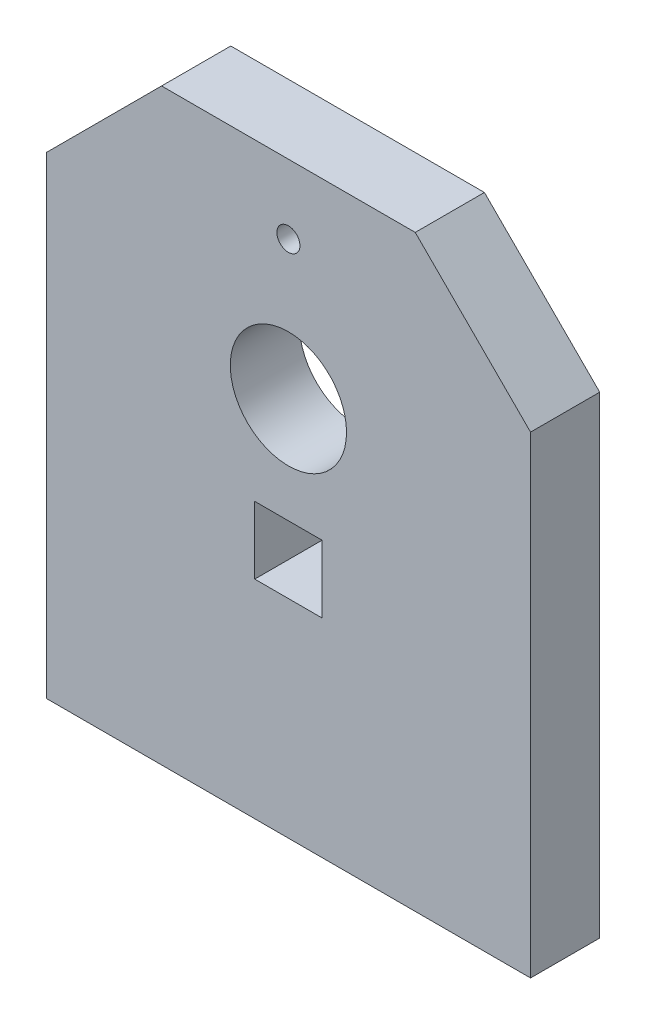
ISO-10303-21;
HEADER;
FILE_DESCRIPTION(('STEP AP214'),'2;1');
FILE_NAME('part.step','',(''),(''),'','','');
FILE_SCHEMA(('AUTOMOTIVE_DESIGN { 1 0 10303 214 1 1 1 1 }'));
ENDSEC;
DATA;
#1=APPLICATION_CONTEXT('core data for automotive mechanical design processes');
#2=APPLICATION_PROTOCOL_DEFINITION('international standard','automotive_design',2000,#1);
#3=PRODUCT_CONTEXT('',#1,'mechanical');
#4=PRODUCT('Part','Part','',(#3));
#5=PRODUCT_RELATED_PRODUCT_CATEGORY('part','',(#4));
#6=PRODUCT_DEFINITION_FORMATION('','',#4);
#7=PRODUCT_DEFINITION_CONTEXT('part definition',#1,'design');
#8=PRODUCT_DEFINITION('design','',#6,#7);
#9=PRODUCT_DEFINITION_SHAPE('','',#8);
#10=(LENGTH_UNIT() NAMED_UNIT(*) SI_UNIT(.MILLI.,.METRE.));
#11=(NAMED_UNIT(*) PLANE_ANGLE_UNIT() SI_UNIT($,.RADIAN.));
#12=(NAMED_UNIT(*) SI_UNIT($,.STERADIAN.) SOLID_ANGLE_UNIT());
#13=UNCERTAINTY_MEASURE_WITH_UNIT(LENGTH_MEASURE(1.E-05),#10,'distance_accuracy_value','');
#14=(GEOMETRIC_REPRESENTATION_CONTEXT(3) GLOBAL_UNCERTAINTY_ASSIGNED_CONTEXT((#13)) GLOBAL_UNIT_ASSIGNED_CONTEXT((#10,
#11,#12)) REPRESENTATION_CONTEXT('',''));
#15=CARTESIAN_POINT('',(0.,0.,0.));
#16=DIRECTION('',(0.,0.,1.));
#17=DIRECTION('',(1.,0.,0.));
#18=AXIS2_PLACEMENT_3D('',#15,#16,#17);
#19=CARTESIAN_POINT('',(0.,-1.87026845637584,3.));
#20=DIRECTION('',(0.,1.,0.));
#21=DIRECTION('',(-1.,0.,0.));
#22=AXIS2_PLACEMENT_3D('',#19,#20,#21);
#23=PLANE('',#22);
#24=DIRECTION('',(1.,0.,0.));
#25=VECTOR('',#24,1.);
#26=CARTESIAN_POINT('',(0.,-1.87026845637584,0.));
#27=LINE('',#26,#25);
#28=CARTESIAN_POINT('',(1.58825589961746,-1.87026845637584,0.));
#29=VERTEX_POINT('',#28);
#30=CARTESIAN_POINT('',(4.50825589961746,-1.87026845637584,0.));
#31=VERTEX_POINT('',#30);
#32=EDGE_CURVE('E167',#29,#31,#27,.T.);
#33=ORIENTED_EDGE('',*,*,#32,.T.);
#34=DIRECTION('',(0.,0.,-1.));
#35=VECTOR('',#34,1.);
#36=CARTESIAN_POINT('',(4.50825589961746,-1.87026845637584,3.));
#37=LINE('',#36,#35);
#38=CARTESIAN_POINT('',(4.50825589961746,-1.87026845637584,3.));
#39=VERTEX_POINT('',#38);
#40=EDGE_CURVE('E11',#39,#31,#37,.T.);
#41=ORIENTED_EDGE('',*,*,#40,.F.);
#42=DIRECTION('',(1.,0.,0.));
#43=VECTOR('',#42,1.);
#44=CARTESIAN_POINT('',(0.,-1.87026845637584,3.));
#45=LINE('',#44,#43);
#46=CARTESIAN_POINT('',(1.58825589961746,-1.87026845637584,3.));
#47=VERTEX_POINT('',#46);
#48=EDGE_CURVE('E126',#47,#39,#45,.T.);
#49=ORIENTED_EDGE('',*,*,#48,.F.);
#50=DIRECTION('',(0.,0.,-1.));
#51=VECTOR('',#50,1.);
#52=CARTESIAN_POINT('',(1.58825589961746,-1.87026845637584,3.));
#53=LINE('',#52,#51);
#54=EDGE_CURVE('E54',#47,#29,#53,.T.);
#55=ORIENTED_EDGE('',*,*,#54,.T.);
#56=EDGE_LOOP('',(#33,#41,#49,#55));
#57=FACE_BOUND('',#56,.T.);
#58=ADVANCED_FACE('F35',(#57),#23,.F.);
#59=CARTESIAN_POINT('',(4.50825589961746,0.,3.));
#60=DIRECTION('',(1.,0.,0.));
#61=DIRECTION('',(0.,0.,-1.));
#62=AXIS2_PLACEMENT_3D('',#59,#60,#61);
#63=PLANE('',#62);
#64=DIRECTION('',(0.,-1.,0.));
#65=VECTOR('',#64,1.);
#66=CARTESIAN_POINT('',(4.50825589961746,0.,0.));
#67=LINE('',#66,#65);
#68=CARTESIAN_POINT('',(4.50825589961746,-4.79026845637584,0.));
#69=VERTEX_POINT('',#68);
#70=EDGE_CURVE('E132',#31,#69,#67,.T.);
#71=ORIENTED_EDGE('',*,*,#70,.T.);
#72=DIRECTION('',(0.,0.,-1.));
#73=VECTOR('',#72,1.);
#74=CARTESIAN_POINT('',(4.50825589961746,-4.79026845637584,3.));
#75=LINE('',#74,#73);
#76=CARTESIAN_POINT('',(4.50825589961746,-4.79026845637584,3.));
#77=VERTEX_POINT('',#76);
#78=EDGE_CURVE('E45',#77,#69,#75,.T.);
#79=ORIENTED_EDGE('',*,*,#78,.F.);
#80=DIRECTION('',(0.,-1.,0.));
#81=VECTOR('',#80,1.);
#82=CARTESIAN_POINT('',(4.50825589961746,0.,3.));
#83=LINE('',#82,#81);
#84=EDGE_CURVE('E120',#39,#77,#83,.T.);
#85=ORIENTED_EDGE('',*,*,#84,.F.);
#86=ORIENTED_EDGE('',*,*,#40,.T.);
#87=EDGE_LOOP('',(#71,#79,#85,#86));
#88=FACE_BOUND('',#87,.T.);
#89=ADVANCED_FACE('F131',(#88),#63,.F.);
#90=CARTESIAN_POINT('',(0.,-4.79026845637584,3.));
#91=DIRECTION('',(0.,1.,0.));
#92=DIRECTION('',(-1.,0.,0.));
#93=AXIS2_PLACEMENT_3D('',#90,#91,#92);
#94=PLANE('',#93);
#95=DIRECTION('',(1.,0.,0.));
#96=VECTOR('',#95,1.);
#97=CARTESIAN_POINT('',(0.,-4.79026845637584,0.));
#98=LINE('',#97,#96);
#99=CARTESIAN_POINT('',(1.58825589961746,-4.79026845637584,0.));
#100=VERTEX_POINT('',#99);
#101=EDGE_CURVE('E170',#100,#69,#98,.T.);
#102=ORIENTED_EDGE('',*,*,#101,.F.);
#103=DIRECTION('',(0.,0.,-1.));
#104=VECTOR('',#103,1.);
#105=CARTESIAN_POINT('',(1.58825589961746,-4.79026845637584,3.));
#106=LINE('',#105,#104);
#107=CARTESIAN_POINT('',(1.58825589961746,-4.79026845637584,3.));
#108=VERTEX_POINT('',#107);
#109=EDGE_CURVE('E86',#108,#100,#106,.T.);
#110=ORIENTED_EDGE('',*,*,#109,.F.);
#111=DIRECTION('',(1.,0.,0.));
#112=VECTOR('',#111,1.);
#113=CARTESIAN_POINT('',(0.,-4.79026845637584,3.));
#114=LINE('',#113,#112);
#115=EDGE_CURVE('E125',#108,#77,#114,.T.);
#116=ORIENTED_EDGE('',*,*,#115,.T.);
#117=ORIENTED_EDGE('',*,*,#78,.T.);
#118=EDGE_LOOP('',(#102,#110,#116,#117));
#119=FACE_BOUND('',#118,.T.);
#120=ADVANCED_FACE('F136',(#119),#94,.T.);
#121=CARTESIAN_POINT('',(0.,11.7097315436242,3.));
#122=DIRECTION('',(0.,1.,0.));
#123=DIRECTION('',(-1.,0.,0.));
#124=AXIS2_PLACEMENT_3D('',#121,#122,#123);
#125=PLANE('',#124);
#126=DIRECTION('',(1.,0.,0.));
#127=VECTOR('',#126,1.);
#128=CARTESIAN_POINT('',(0.,11.7097315436242,0.));
#129=LINE('',#128,#127);
#130=CARTESIAN_POINT('',(-2.45174410038254,11.7097315436242,0.));
#131=VERTEX_POINT('',#130);
#132=CARTESIAN_POINT('',(8.54825589961746,11.7097315436242,0.));
#133=VERTEX_POINT('',#132);
#134=EDGE_CURVE('E149',#131,#133,#129,.T.);
#135=ORIENTED_EDGE('',*,*,#134,.F.);
#136=DIRECTION('',(0.,0.,-1.));
#137=VECTOR('',#136,1.);
#138=CARTESIAN_POINT('',(-2.45174410038254,11.7097315436242,3.));
#139=LINE('',#138,#137);
#140=CARTESIAN_POINT('',(-2.45174410038254,11.7097315436242,3.));
#141=VERTEX_POINT('',#140);
#142=EDGE_CURVE('E39',#141,#131,#139,.T.);
#143=ORIENTED_EDGE('',*,*,#142,.F.);
#144=DIRECTION('',(1.,0.,0.));
#145=VECTOR('',#144,1.);
#146=CARTESIAN_POINT('',(0.,11.7097315436242,3.));
#147=LINE('',#146,#145);
#148=CARTESIAN_POINT('',(8.54825589961746,11.7097315436242,3.));
#149=VERTEX_POINT('',#148);
#150=EDGE_CURVE('E200',#141,#149,#147,.T.);
#151=ORIENTED_EDGE('',*,*,#150,.T.);
#152=DIRECTION('',(0.,0.,-1.));
#153=VECTOR('',#152,1.);
#154=CARTESIAN_POINT('',(8.54825589961746,11.7097315436242,3.));
#155=LINE('',#154,#153);
#156=EDGE_CURVE('E139',#149,#133,#155,.T.);
#157=ORIENTED_EDGE('',*,*,#156,.T.);
#158=EDGE_LOOP('',(#135,#143,#151,#157));
#159=FACE_BOUND('',#158,.T.);
#160=ADVANCED_FACE('F199',(#159),#125,.T.);
#161=CARTESIAN_POINT('',(-7.08073782200335,7.08073782200335,3.));
#162=DIRECTION('',(0.707106781186547,-0.707106781186547,0.));
#163=DIRECTION('',(0.707106781186548,0.707106781186548,0.));
#164=AXIS2_PLACEMENT_3D('',#161,#162,#163);
#165=PLANE('',#164);
#166=DIRECTION('',(-0.707106781186548,-0.707106781186548,0.));
#167=VECTOR('',#166,1.);
#168=CARTESIAN_POINT('',(-7.08073782200335,7.08073782200335,0.));
#169=LINE('',#168,#167);
#170=CARTESIAN_POINT('',(-7.45174410038254,6.70973154362416,0.));
#171=VERTEX_POINT('',#170);
#172=EDGE_CURVE('E152',#131,#171,#169,.T.);
#173=ORIENTED_EDGE('',*,*,#172,.T.);
#174=DIRECTION('',(0.,0.,-1.));
#175=VECTOR('',#174,1.);
#176=CARTESIAN_POINT('',(-7.45174410038254,6.70973154362416,3.));
#177=LINE('',#176,#175);
#178=CARTESIAN_POINT('',(-7.45174410038254,6.70973154362416,3.));
#179=VERTEX_POINT('',#178);
#180=EDGE_CURVE('E185',#179,#171,#177,.T.);
#181=ORIENTED_EDGE('',*,*,#180,.F.);
#182=DIRECTION('',(-0.707106781186548,-0.707106781186548,0.));
#183=VECTOR('',#182,1.);
#184=CARTESIAN_POINT('',(-7.08073782200335,7.08073782200335,3.));
#185=LINE('',#184,#183);
#186=EDGE_CURVE('E193',#141,#179,#185,.T.);
#187=ORIENTED_EDGE('',*,*,#186,.F.);
#188=ORIENTED_EDGE('',*,*,#142,.T.);
#189=EDGE_LOOP('',(#173,#181,#187,#188));
#190=FACE_BOUND('',#189,.T.);
#191=ADVANCED_FACE('F191',(#190),#165,.F.);
#192=CARTESIAN_POINT('',(-7.45174410038254,0.,3.));
#193=DIRECTION('',(1.,0.,0.));
#194=DIRECTION('',(0.,1.,0.));
#195=AXIS2_PLACEMENT_3D('',#192,#193,#194);
#196=PLANE('',#195);
#197=DIRECTION('',(0.,-1.,0.));
#198=VECTOR('',#197,1.);
#199=CARTESIAN_POINT('',(-7.45174410038254,0.,0.));
#200=LINE('',#199,#198);
#201=CARTESIAN_POINT('',(-7.45174410038254,-13.7902684563758,0.));
#202=VERTEX_POINT('',#201);
#203=EDGE_CURVE('E155',#171,#202,#200,.T.);
#204=ORIENTED_EDGE('',*,*,#203,.T.);
#205=DIRECTION('',(0.,0.,-1.));
#206=VECTOR('',#205,1.);
#207=CARTESIAN_POINT('',(-7.45174410038254,-13.7902684563758,3.));
#208=LINE('',#207,#206);
#209=CARTESIAN_POINT('',(-7.45174410038254,-13.7902684563758,3.));
#210=VERTEX_POINT('',#209);
#211=EDGE_CURVE('E183',#210,#202,#208,.T.);
#212=ORIENTED_EDGE('',*,*,#211,.F.);
#213=DIRECTION('',(0.,-1.,0.));
#214=VECTOR('',#213,1.);
#215=CARTESIAN_POINT('',(-7.45174410038254,0.,3.));
#216=LINE('',#215,#214);
#217=EDGE_CURVE('E348',#179,#210,#216,.T.);
#218=ORIENTED_EDGE('',*,*,#217,.F.);
#219=ORIENTED_EDGE('',*,*,#180,.T.);
#220=EDGE_LOOP('',(#204,#212,#218,#219));
#221=FACE_BOUND('',#220,.T.);
#222=ADVANCED_FACE('F218',(#221),#196,.F.);
#223=CARTESIAN_POINT('',(0.,-13.7902684563758,3.));
#224=DIRECTION('',(0.,1.,0.));
#225=DIRECTION('',(-1.,0.,0.));
#226=AXIS2_PLACEMENT_3D('',#223,#224,#225);
#227=PLANE('',#226);
#228=DIRECTION('',(1.,0.,0.));
#229=VECTOR('',#228,1.);
#230=CARTESIAN_POINT('',(0.,-13.7902684563758,0.));
#231=LINE('',#230,#229);
#232=CARTESIAN_POINT('',(13.5482558996175,-13.7902684563758,0.));
#233=VERTEX_POINT('',#232);
#234=EDGE_CURVE('E158',#202,#233,#231,.T.);
#235=ORIENTED_EDGE('',*,*,#234,.T.);
#236=DIRECTION('',(0.,0.,-1.));
#237=VECTOR('',#236,1.);
#238=CARTESIAN_POINT('',(13.5482558996175,-13.7902684563758,3.));
#239=LINE('',#238,#237);
#240=CARTESIAN_POINT('',(13.5482558996175,-13.7902684563758,3.));
#241=VERTEX_POINT('',#240);
#242=EDGE_CURVE('E181',#241,#233,#239,.T.);
#243=ORIENTED_EDGE('',*,*,#242,.F.);
#244=DIRECTION('',(1.,0.,0.));
#245=VECTOR('',#244,1.);
#246=CARTESIAN_POINT('',(0.,-13.7902684563758,3.));
#247=LINE('',#246,#245);
#248=EDGE_CURVE('E216',#210,#241,#247,.T.);
#249=ORIENTED_EDGE('',*,*,#248,.F.);
#250=ORIENTED_EDGE('',*,*,#211,.T.);
#251=EDGE_LOOP('',(#235,#243,#249,#250));
#252=FACE_BOUND('',#251,.T.);
#253=ADVANCED_FACE('F214',(#252),#227,.F.);
#254=CARTESIAN_POINT('',(13.5482558996175,0.,3.));
#255=DIRECTION('',(1.,0.,0.));
#256=DIRECTION('',(0.,1.,0.));
#257=AXIS2_PLACEMENT_3D('',#254,#255,#256);
#258=PLANE('',#257);
#259=DIRECTION('',(0.,-1.,0.));
#260=VECTOR('',#259,1.);
#261=CARTESIAN_POINT('',(13.5482558996175,0.,0.));
#262=LINE('',#261,#260);
#263=CARTESIAN_POINT('',(13.5482558996175,6.70973154362416,0.));
#264=VERTEX_POINT('',#263);
#265=EDGE_CURVE('E161',#264,#233,#262,.T.);
#266=ORIENTED_EDGE('',*,*,#265,.F.);
#267=DIRECTION('',(0.,0.,-1.));
#268=VECTOR('',#267,1.);
#269=CARTESIAN_POINT('',(13.5482558996175,6.70973154362416,3.));
#270=LINE('',#269,#268);
#271=CARTESIAN_POINT('',(13.5482558996175,6.70973154362416,3.));
#272=VERTEX_POINT('',#271);
#273=EDGE_CURVE('E179',#272,#264,#270,.T.);
#274=ORIENTED_EDGE('',*,*,#273,.F.);
#275=DIRECTION('',(0.,-1.,0.));
#276=VECTOR('',#275,1.);
#277=CARTESIAN_POINT('',(13.5482558996175,0.,3.));
#278=LINE('',#277,#276);
#279=EDGE_CURVE('E212',#272,#241,#278,.T.);
#280=ORIENTED_EDGE('',*,*,#279,.T.);
#281=ORIENTED_EDGE('',*,*,#242,.T.);
#282=EDGE_LOOP('',(#266,#274,#280,#281));
#283=FACE_BOUND('',#282,.T.);
#284=ADVANCED_FACE('F208',(#283),#258,.T.);
#285=CARTESIAN_POINT('',(10.1289937216208,10.1289937216208,3.));
#286=DIRECTION('',(0.707106781186547,0.707106781186548,0.));
#287=DIRECTION('',(-0.707106781186548,0.707106781186547,0.));
#288=AXIS2_PLACEMENT_3D('',#285,#286,#287);
#289=PLANE('',#288);
#290=DIRECTION('',(0.707106781186548,-0.707106781186547,0.));
#291=VECTOR('',#290,1.);
#292=CARTESIAN_POINT('',(10.1289937216208,10.1289937216208,0.));
#293=LINE('',#292,#291);
#294=EDGE_CURVE('E164',#133,#264,#293,.T.);
#295=ORIENTED_EDGE('',*,*,#294,.F.);
#296=ORIENTED_EDGE('',*,*,#156,.F.);
#297=DIRECTION('',(0.707106781186548,-0.707106781186547,0.));
#298=VECTOR('',#297,1.);
#299=CARTESIAN_POINT('',(10.1289937216208,10.1289937216208,3.));
#300=LINE('',#299,#298);
#301=EDGE_CURVE('E205',#149,#272,#300,.T.);
#302=ORIENTED_EDGE('',*,*,#301,.T.);
#303=ORIENTED_EDGE('',*,*,#273,.T.);
#304=EDGE_LOOP('',(#295,#296,#302,#303));
#305=FACE_BOUND('',#304,.T.);
#306=ADVANCED_FACE('F204',(#305),#289,.T.);
#307=CARTESIAN_POINT('',(3.04825589961744,2.70973154362416,3.));
#308=DIRECTION('',(0.,0.,-1.));
#309=DIRECTION('',(-1.,0.,0.));
#310=AXIS2_PLACEMENT_3D('',#307,#308,#309);
#311=CYLINDRICAL_SURFACE('',#310,2.52);
#312=CARTESIAN_POINT('',(3.04825589961744,2.70973154362416,3.));
#313=DIRECTION('',(0.,0.,1.));
#314=DIRECTION('',(1.,0.,0.));
#315=AXIS2_PLACEMENT_3D('',#312,#313,#314);
#316=CIRCLE('',#315,2.52);
#317=CARTESIAN_POINT('',(5.56825589961744,2.70973154362416,3.));
#318=VERTEX_POINT('',#317);
#319=EDGE_CURVE('E346',#318,#318,#316,.T.);
#320=ORIENTED_EDGE('',*,*,#319,.T.);
#321=EDGE_LOOP('',(#320));
#322=FACE_BOUND('',#321,.T.);
#323=CARTESIAN_POINT('',(3.04825589961744,2.70973154362416,0.));
#324=DIRECTION('',(0.,0.,1.));
#325=DIRECTION('',(1.,0.,0.));
#326=AXIS2_PLACEMENT_3D('',#323,#324,#325);
#327=CIRCLE('',#326,2.52);
#328=CARTESIAN_POINT('',(5.56825589961744,2.70973154362416,0.));
#329=VERTEX_POINT('',#328);
#330=EDGE_CURVE('E146',#329,#329,#327,.T.);
#331=ORIENTED_EDGE('',*,*,#330,.F.);
#332=EDGE_LOOP('',(#331));
#333=FACE_BOUND('',#332,.T.);
#334=ADVANCED_FACE('F237',(#322,#333),#311,.F.);
#335=CARTESIAN_POINT('',(3.04825589961746,8.70973154362416,3.));
#336=DIRECTION('',(0.,0.,-1.));
#337=DIRECTION('',(-1.,0.,0.));
#338=AXIS2_PLACEMENT_3D('',#335,#336,#337);
#339=CYLINDRICAL_SURFACE('',#338,0.5);
#340=CARTESIAN_POINT('',(3.04825589961746,8.70973154362416,3.));
#341=DIRECTION('',(0.,0.,1.));
#342=DIRECTION('',(1.,0.,0.));
#343=AXIS2_PLACEMENT_3D('',#340,#341,#342);
#344=CIRCLE('',#343,0.5);
#345=CARTESIAN_POINT('',(3.54825589961746,8.70973154362416,3.));
#346=VERTEX_POINT('',#345);
#347=EDGE_CURVE('E175',#346,#346,#344,.T.);
#348=ORIENTED_EDGE('',*,*,#347,.T.);
#349=EDGE_LOOP('',(#348));
#350=FACE_BOUND('',#349,.T.);
#351=CARTESIAN_POINT('',(3.04825589961746,8.70973154362416,0.));
#352=DIRECTION('',(0.,0.,1.));
#353=DIRECTION('',(1.,0.,0.));
#354=AXIS2_PLACEMENT_3D('',#351,#352,#353);
#355=CIRCLE('',#354,0.5);
#356=CARTESIAN_POINT('',(3.54825589961746,8.70973154362416,0.));
#357=VERTEX_POINT('',#356);
#358=EDGE_CURVE('E143',#357,#357,#355,.T.);
#359=ORIENTED_EDGE('',*,*,#358,.F.);
#360=EDGE_LOOP('',(#359));
#361=FACE_BOUND('',#360,.T.);
#362=ADVANCED_FACE('F37',(#350,#361),#339,.F.);
#363=CARTESIAN_POINT('',(1.58825589961746,0.,3.));
#364=DIRECTION('',(1.,0.,0.));
#365=DIRECTION('',(0.,1.,0.));
#366=AXIS2_PLACEMENT_3D('',#363,#364,#365);
#367=PLANE('',#366);
#368=DIRECTION('',(0.,-1.,0.));
#369=VECTOR('',#368,1.);
#370=CARTESIAN_POINT('',(1.58825589961746,0.,0.));
#371=LINE('',#370,#369);
#372=EDGE_CURVE('E172',#29,#100,#371,.T.);
#373=ORIENTED_EDGE('',*,*,#372,.F.);
#374=ORIENTED_EDGE('',*,*,#54,.F.);
#375=DIRECTION('',(0.,-1.,0.));
#376=VECTOR('',#375,1.);
#377=CARTESIAN_POINT('',(1.58825589961746,0.,3.));
#378=LINE('',#377,#376);
#379=EDGE_CURVE('E137',#47,#108,#378,.T.);
#380=ORIENTED_EDGE('',*,*,#379,.T.);
#381=ORIENTED_EDGE('',*,*,#109,.T.);
#382=EDGE_LOOP('',(#373,#374,#380,#381));
#383=FACE_BOUND('',#382,.T.);
#384=ADVANCED_FACE('F259',(#383),#367,.T.);
#385=CARTESIAN_POINT('',(0.,0.,3.));
#386=DIRECTION('',(0.,0.,1.));
#387=DIRECTION('',(1.,0.,0.));
#388=AXIS2_PLACEMENT_3D('',#385,#386,#387);
#389=PLANE('',#388);
#390=ORIENTED_EDGE('',*,*,#347,.F.);
#391=EDGE_LOOP('',(#390));
#392=FACE_BOUND('',#391,.T.);
#393=ORIENTED_EDGE('',*,*,#319,.F.);
#394=EDGE_LOOP('',(#393));
#395=FACE_BOUND('',#394,.T.);
#396=ORIENTED_EDGE('',*,*,#150,.F.);
#397=ORIENTED_EDGE('',*,*,#186,.T.);
#398=ORIENTED_EDGE('',*,*,#217,.T.);
#399=ORIENTED_EDGE('',*,*,#248,.T.);
#400=ORIENTED_EDGE('',*,*,#279,.F.);
#401=ORIENTED_EDGE('',*,*,#301,.F.);
#402=EDGE_LOOP('',(#396,#397,#398,#399,#400,#401));
#403=FACE_BOUND('',#402,.T.);
#404=ORIENTED_EDGE('',*,*,#48,.T.);
#405=ORIENTED_EDGE('',*,*,#84,.T.);
#406=ORIENTED_EDGE('',*,*,#115,.F.);
#407=ORIENTED_EDGE('',*,*,#379,.F.);
#408=EDGE_LOOP('',(#404,#405,#406,#407));
#409=FACE_BOUND('',#408,.T.);
#410=ADVANCED_FACE('F122',(#392,#395,#403,#409),#389,.T.);
#411=CARTESIAN_POINT('',(0.,0.,0.));
#412=DIRECTION('',(0.,0.,1.));
#413=DIRECTION('',(1.,0.,0.));
#414=AXIS2_PLACEMENT_3D('',#411,#412,#413);
#415=PLANE('',#414);
#416=ORIENTED_EDGE('',*,*,#358,.T.);
#417=EDGE_LOOP('',(#416));
#418=FACE_BOUND('',#417,.T.);
#419=ORIENTED_EDGE('',*,*,#330,.T.);
#420=EDGE_LOOP('',(#419));
#421=FACE_BOUND('',#420,.T.);
#422=ORIENTED_EDGE('',*,*,#134,.T.);
#423=ORIENTED_EDGE('',*,*,#294,.T.);
#424=ORIENTED_EDGE('',*,*,#265,.T.);
#425=ORIENTED_EDGE('',*,*,#234,.F.);
#426=ORIENTED_EDGE('',*,*,#203,.F.);
#427=ORIENTED_EDGE('',*,*,#172,.F.);
#428=EDGE_LOOP('',(#422,#423,#424,#425,#426,#427));
#429=FACE_BOUND('',#428,.T.);
#430=ORIENTED_EDGE('',*,*,#32,.F.);
#431=ORIENTED_EDGE('',*,*,#372,.T.);
#432=ORIENTED_EDGE('',*,*,#101,.T.);
#433=ORIENTED_EDGE('',*,*,#70,.F.);
#434=EDGE_LOOP('',(#430,#431,#432,#433));
#435=FACE_BOUND('',#434,.T.);
#436=ADVANCED_FACE('F196',(#418,#421,#429,#435),#415,.F.);
#437=CLOSED_SHELL('',(#58,#89,#120,#160,#191,#222,#253,#284,#306,#334,#362,#384,#410,#436));
#438=MANIFOLD_SOLID_BREP('B2',#437);
#439=ADVANCED_BREP_SHAPE_REPRESENTATION('',(#18,#438),#14);
#440=SHAPE_DEFINITION_REPRESENTATION(#9,#439);
ENDSEC;
END-ISO-10303-21;
